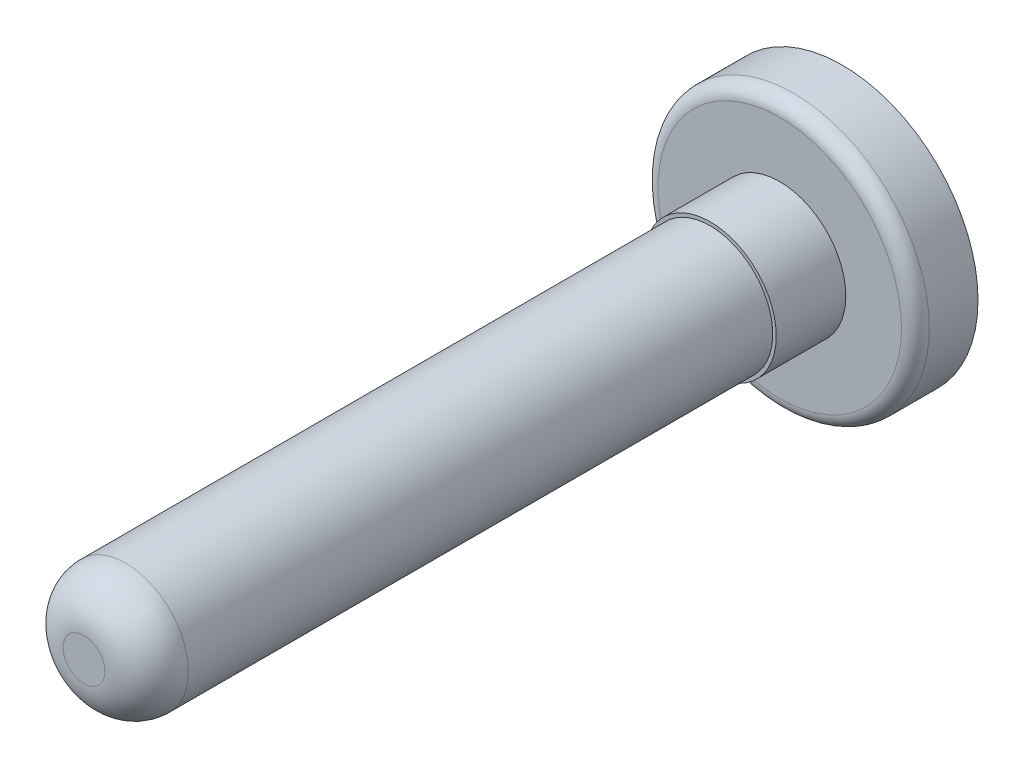
ISO-10303-21;
HEADER;
FILE_DESCRIPTION(('STEP AP214'),'2;1');
FILE_NAME('part.step','',(''),(''),'','','');
FILE_SCHEMA(('AUTOMOTIVE_DESIGN { 1 0 10303 214 1 1 1 1 }'));
ENDSEC;
DATA;
#1=APPLICATION_CONTEXT('core data for automotive mechanical design processes');
#2=APPLICATION_PROTOCOL_DEFINITION('international standard','automotive_design',2000,#1);
#3=PRODUCT_CONTEXT('',#1,'mechanical');
#4=PRODUCT('Part','Part','',(#3));
#5=PRODUCT_RELATED_PRODUCT_CATEGORY('part','',(#4));
#6=PRODUCT_DEFINITION_FORMATION('','',#4);
#7=PRODUCT_DEFINITION_CONTEXT('part definition',#1,'design');
#8=PRODUCT_DEFINITION('design','',#6,#7);
#9=PRODUCT_DEFINITION_SHAPE('','',#8);
#10=(LENGTH_UNIT() NAMED_UNIT(*) SI_UNIT(.MILLI.,.METRE.));
#11=(NAMED_UNIT(*) PLANE_ANGLE_UNIT() SI_UNIT($,.RADIAN.));
#12=(NAMED_UNIT(*) SI_UNIT($,.STERADIAN.) SOLID_ANGLE_UNIT());
#13=UNCERTAINTY_MEASURE_WITH_UNIT(LENGTH_MEASURE(1.E-05),#10,'distance_accuracy_value','');
#14=(GEOMETRIC_REPRESENTATION_CONTEXT(3) GLOBAL_UNCERTAINTY_ASSIGNED_CONTEXT((#13)) GLOBAL_UNIT_ASSIGNED_CONTEXT((#10,
#11,#12)) REPRESENTATION_CONTEXT('',''));
#15=CARTESIAN_POINT('',(0.,0.,0.));
#16=DIRECTION('',(0.,0.,1.));
#17=DIRECTION('',(1.,0.,0.));
#18=AXIS2_PLACEMENT_3D('',#15,#16,#17);
#19=CARTESIAN_POINT('',(0.,0.,4.5));
#20=DIRECTION('',(0.,0.,-1.));
#21=DIRECTION('',(-1.,0.,0.));
#22=AXIS2_PLACEMENT_3D('',#19,#20,#21);
#23=CYLINDRICAL_SURFACE('',#22,9.75);
#24=CARTESIAN_POINT('',(0.,0.,3.5));
#25=DIRECTION('',(0.,0.,1.));
#26=DIRECTION('',(1.,0.,0.));
#27=AXIS2_PLACEMENT_3D('',#24,#25,#26);
#28=CIRCLE('',#27,9.75);
#29=CARTESIAN_POINT('',(9.75,0.,3.5));
#30=VERTEX_POINT('',#29);
#31=EDGE_CURVE('E10',#30,#30,#28,.F.);
#32=ORIENTED_EDGE('',*,*,#31,.T.);
#33=EDGE_LOOP('',(#32));
#34=FACE_BOUND('',#33,.T.);
#35=CARTESIAN_POINT('',(0.,0.,0.));
#36=DIRECTION('',(0.,0.,1.));
#37=DIRECTION('',(1.,0.,0.));
#38=AXIS2_PLACEMENT_3D('',#35,#36,#37);
#39=CIRCLE('',#38,9.75);
#40=CARTESIAN_POINT('',(9.75,0.,0.));
#41=VERTEX_POINT('',#40);
#42=EDGE_CURVE('E62',#41,#41,#39,.T.);
#43=ORIENTED_EDGE('',*,*,#42,.T.);
#44=EDGE_LOOP('',(#43));
#45=FACE_BOUND('',#44,.T.);
#46=ADVANCED_FACE('F37',(#34,#45),#23,.T.);
#47=CARTESIAN_POINT('',(0.,0.,4.5));
#48=DIRECTION('',(0.,0.,1.));
#49=DIRECTION('',(1.,0.,0.));
#50=AXIS2_PLACEMENT_3D('',#47,#48,#49);
#51=PLANE('',#50);
#52=CARTESIAN_POINT('',(0.,0.,4.5));
#53=DIRECTION('',(0.,0.,1.));
#54=DIRECTION('',(1.,0.,0.));
#55=AXIS2_PLACEMENT_3D('',#52,#53,#54);
#56=CIRCLE('',#55,8.75);
#57=CARTESIAN_POINT('',(8.75,0.,4.5));
#58=VERTEX_POINT('',#57);
#59=EDGE_CURVE('E45',#58,#58,#56,.T.);
#60=ORIENTED_EDGE('',*,*,#59,.T.);
#61=EDGE_LOOP('',(#60));
#62=FACE_BOUND('',#61,.T.);
#63=CARTESIAN_POINT('',(0.,0.,4.5));
#64=DIRECTION('',(0.,0.,1.));
#65=DIRECTION('',(1.,0.,0.));
#66=AXIS2_PLACEMENT_3D('',#63,#64,#65);
#67=CIRCLE('',#66,4.75);
#68=CARTESIAN_POINT('',(4.75,0.,4.5));
#69=VERTEX_POINT('',#68);
#70=EDGE_CURVE('E66',#69,#69,#67,.T.);
#71=ORIENTED_EDGE('',*,*,#70,.F.);
#72=EDGE_LOOP('',(#71));
#73=FACE_BOUND('',#72,.T.);
#74=ADVANCED_FACE('F93',(#62,#73),#51,.T.);
#75=CARTESIAN_POINT('',(0.,0.,0.));
#76=DIRECTION('',(0.,0.,1.));
#77=DIRECTION('',(1.,0.,0.));
#78=AXIS2_PLACEMENT_3D('',#75,#76,#77);
#79=PLANE('',#78);
#80=ORIENTED_EDGE('',*,*,#42,.F.);
#81=EDGE_LOOP('',(#80));
#82=FACE_BOUND('',#81,.T.);
#83=ADVANCED_FACE('F89',(#82),#79,.F.);
#84=CARTESIAN_POINT('',(0.,0.,9.5));
#85=DIRECTION('',(0.,0.,-1.));
#86=DIRECTION('',(-1.,0.,0.));
#87=AXIS2_PLACEMENT_3D('',#84,#85,#86);
#88=CYLINDRICAL_SURFACE('',#87,4.75);
#89=CARTESIAN_POINT('',(0.,0.,9.5));
#90=DIRECTION('',(0.,0.,1.));
#91=DIRECTION('',(1.,0.,0.));
#92=AXIS2_PLACEMENT_3D('',#89,#90,#91);
#93=CIRCLE('',#92,4.75);
#94=CARTESIAN_POINT('',(4.75,0.,9.5));
#95=VERTEX_POINT('',#94);
#96=EDGE_CURVE('E67',#95,#95,#93,.T.);
#97=ORIENTED_EDGE('',*,*,#96,.F.);
#98=EDGE_LOOP('',(#97));
#99=FACE_BOUND('',#98,.T.);
#100=ORIENTED_EDGE('',*,*,#70,.T.);
#101=EDGE_LOOP('',(#100));
#102=FACE_BOUND('',#101,.T.);
#103=ADVANCED_FACE('F83',(#99,#102),#88,.T.);
#104=CARTESIAN_POINT('',(0.,0.,9.5));
#105=DIRECTION('',(0.,0.,1.));
#106=DIRECTION('',(1.,0.,0.));
#107=AXIS2_PLACEMENT_3D('',#104,#105,#106);
#108=PLANE('',#107);
#109=CARTESIAN_POINT('',(0.,0.,9.5));
#110=DIRECTION('',(0.,0.,1.));
#111=DIRECTION('',(1.,0.,0.));
#112=AXIS2_PLACEMENT_3D('',#109,#110,#111);
#113=CIRCLE('',#112,4.5);
#114=CARTESIAN_POINT('',(-4.5,0.,9.49999999999999));
#115=VERTEX_POINT('',#114);
#116=EDGE_CURVE('E61',#115,#115,#113,.T.);
#117=ORIENTED_EDGE('',*,*,#116,.F.);
#118=EDGE_LOOP('',(#117));
#119=FACE_BOUND('',#118,.T.);
#120=ORIENTED_EDGE('',*,*,#96,.T.);
#121=EDGE_LOOP('',(#120));
#122=FACE_BOUND('',#121,.T.);
#123=ADVANCED_FACE('F80',(#119,#122),#108,.T.);
#124=CARTESIAN_POINT('',(0.,0.,54.5));
#125=DIRECTION('',(0.,0.,-1.));
#126=DIRECTION('',(-1.,0.,0.));
#127=AXIS2_PLACEMENT_3D('',#124,#125,#126);
#128=CYLINDRICAL_SURFACE('',#127,4.5);
#129=CARTESIAN_POINT('',(0.,0.,51.5));
#130=DIRECTION('',(0.,0.,1.));
#131=DIRECTION('',(1.,0.,0.));
#132=AXIS2_PLACEMENT_3D('',#129,#130,#131);
#133=CIRCLE('',#132,4.5);
#134=CARTESIAN_POINT('',(-4.5,0.,51.5));
#135=VERTEX_POINT('',#134);
#136=EDGE_CURVE('E50',#135,#135,#133,.F.);
#137=CARTESIAN_POINT('',(-4.5,0.,51.5));
#138=CARTESIAN_POINT('',(-4.5,0.,51.0625));
#139=CARTESIAN_POINT('',(-4.5,0.,50.625));
#140=CARTESIAN_POINT('',(-4.5,0.,49.75));
#141=CARTESIAN_POINT('',(-4.5,0.,49.3125));
#142=CARTESIAN_POINT('',(-4.5,0.,48.4375));
#143=CARTESIAN_POINT('',(-4.5,0.,48.));
#144=CARTESIAN_POINT('',(-4.5,0.,47.125));
#145=CARTESIAN_POINT('',(-4.5,0.,46.6875));
#146=CARTESIAN_POINT('',(-4.5,0.,45.8125));
#147=CARTESIAN_POINT('',(-4.5,0.,45.375));
#148=CARTESIAN_POINT('',(-4.5,0.,44.5));
#149=CARTESIAN_POINT('',(-4.5,0.,44.0625));
#150=CARTESIAN_POINT('',(-4.5,0.,43.1875));
#151=CARTESIAN_POINT('',(-4.5,0.,42.75));
#152=CARTESIAN_POINT('',(-4.5,0.,41.875));
#153=CARTESIAN_POINT('',(-4.5,0.,41.4375));
#154=CARTESIAN_POINT('',(-4.5,0.,40.5625));
#155=CARTESIAN_POINT('',(-4.5,0.,40.125));
#156=CARTESIAN_POINT('',(-4.5,0.,39.25));
#157=CARTESIAN_POINT('',(-4.5,0.,38.8125));
#158=CARTESIAN_POINT('',(-4.5,0.,37.9375));
#159=CARTESIAN_POINT('',(-4.5,0.,37.5));
#160=CARTESIAN_POINT('',(-4.5,0.,36.625));
#161=CARTESIAN_POINT('',(-4.5,0.,36.1875));
#162=CARTESIAN_POINT('',(-4.5,0.,35.3125));
#163=CARTESIAN_POINT('',(-4.5,0.,34.875));
#164=CARTESIAN_POINT('',(-4.5,0.,34.));
#165=CARTESIAN_POINT('',(-4.5,0.,33.5625));
#166=CARTESIAN_POINT('',(-4.5,0.,32.6875));
#167=CARTESIAN_POINT('',(-4.5,0.,32.25));
#168=CARTESIAN_POINT('',(-4.5,0.,31.375));
#169=CARTESIAN_POINT('',(-4.5,0.,30.9375));
#170=CARTESIAN_POINT('',(-4.5,0.,30.0625));
#171=CARTESIAN_POINT('',(-4.5,0.,29.625));
#172=CARTESIAN_POINT('',(-4.5,0.,28.75));
#173=CARTESIAN_POINT('',(-4.5,0.,28.3125));
#174=CARTESIAN_POINT('',(-4.5,0.,27.4375));
#175=CARTESIAN_POINT('',(-4.5,0.,27.));
#176=CARTESIAN_POINT('',(-4.5,0.,26.125));
#177=CARTESIAN_POINT('',(-4.5,0.,25.6875));
#178=CARTESIAN_POINT('',(-4.5,0.,24.8125));
#179=CARTESIAN_POINT('',(-4.5,0.,24.375));
#180=CARTESIAN_POINT('',(-4.5,0.,23.5));
#181=CARTESIAN_POINT('',(-4.5,0.,23.0625));
#182=CARTESIAN_POINT('',(-4.5,0.,22.1875));
#183=CARTESIAN_POINT('',(-4.5,0.,21.75));
#184=CARTESIAN_POINT('',(-4.5,0.,20.875));
#185=CARTESIAN_POINT('',(-4.5,0.,20.4375));
#186=CARTESIAN_POINT('',(-4.5,0.,19.5625));
#187=CARTESIAN_POINT('',(-4.5,0.,19.125));
#188=CARTESIAN_POINT('',(-4.5,0.,18.25));
#189=CARTESIAN_POINT('',(-4.5,0.,17.8125));
#190=CARTESIAN_POINT('',(-4.5,0.,16.9375));
#191=CARTESIAN_POINT('',(-4.5,0.,16.5));
#192=CARTESIAN_POINT('',(-4.5,0.,15.625));
#193=CARTESIAN_POINT('',(-4.5,0.,15.1875));
#194=CARTESIAN_POINT('',(-4.5,0.,14.3125));
#195=CARTESIAN_POINT('',(-4.5,0.,13.875));
#196=CARTESIAN_POINT('',(-4.5,0.,13.));
#197=CARTESIAN_POINT('',(-4.5,0.,12.5625));
#198=CARTESIAN_POINT('',(-4.5,0.,11.6875));
#199=CARTESIAN_POINT('',(-4.5,0.,11.25));
#200=CARTESIAN_POINT('',(-4.5,0.,10.375));
#201=CARTESIAN_POINT('',(-4.5,0.,9.93749999999999));
#202=CARTESIAN_POINT('',(-4.5,0.,9.49999999999999));
#203=B_SPLINE_CURVE_WITH_KNOTS('',3,(#137,#138,#139,#140,#141,#142,#143,#144,#145,#146,#147,
#148,#149,#150,#151,#152,#153,#154,#155,#156,#157,#158,#159,#160,#161,#162,#163,#164,#165,#166,
#167,#168,#169,#170,#171,#172,#173,#174,#175,#176,#177,#178,#179,#180,#181,#182,#183,#184,#185,
#186,#187,#188,#189,#190,#191,#192,#193,#194,#195,#196,#197,#198,#199,#200,#201,#202),
.UNSPECIFIED.,.F.,.F.,(4,2,2,2,2,2,2,2,2,2,2,2,2,2,2,2,2,2,2,2,2,2,2,2,2,2,2,2,2,2,2,2,4),(0.,
1.3125,2.625,3.9375,5.25,6.56250000000001,7.875,9.1875,10.5,11.8125,13.125,14.4375,15.75,
17.0625,18.375,19.6875,21.,22.3125,23.625,24.9375,26.25,27.5625,28.875,30.1875,31.5,32.8125,
34.125,35.4375,36.75,38.0625,39.375,40.6875,42.),.UNSPECIFIED.);
#204=EDGE_CURVE('BSEAM78',#135,#115,#203,.T.);
#205=ORIENTED_EDGE('',*,*,#136,.T.);
#206=ORIENTED_EDGE('',*,*,#116,.T.);
#207=ORIENTED_EDGE('',*,*,#204,.T.);
#208=ORIENTED_EDGE('',*,*,#204,.F.);
#209=EDGE_LOOP('',(#205,#207,#206,#208));
#210=FACE_BOUND('',#209,.T.);
#211=ADVANCED_FACE('F78',(#210),#128,.T.);
#212=CARTESIAN_POINT('',(0.,0.,54.5));
#213=DIRECTION('',(0.,0.,1.));
#214=DIRECTION('',(1.,0.,0.));
#215=AXIS2_PLACEMENT_3D('',#212,#213,#214);
#216=PLANE('',#215);
#217=CARTESIAN_POINT('',(0.,0.,54.5));
#218=DIRECTION('',(0.,0.,1.));
#219=DIRECTION('',(1.,0.,0.));
#220=AXIS2_PLACEMENT_3D('',#217,#218,#219);
#221=CIRCLE('',#220,1.5);
#222=CARTESIAN_POINT('',(1.5,0.,54.5));
#223=VERTEX_POINT('',#222);
#224=EDGE_CURVE('E55',#223,#223,#221,.T.);
#225=ORIENTED_EDGE('',*,*,#224,.T.);
#226=EDGE_LOOP('',(#225));
#227=FACE_BOUND('',#226,.T.);
#228=ADVANCED_FACE('F105',(#227),#216,.T.);
#229=CARTESIAN_POINT('',(0.,0.,51.5));
#230=DIRECTION('',(0.,0.,1.));
#231=DIRECTION('',(1.,0.,0.));
#232=AXIS2_PLACEMENT_3D('',#229,#230,#231);
#233=DEGENERATE_TOROIDAL_SURFACE('',#232,1.5,3.,.T.);
#234=ORIENTED_EDGE('',*,*,#136,.F.);
#235=EDGE_LOOP('',(#234));
#236=FACE_BOUND('',#235,.T.);
#237=ORIENTED_EDGE('',*,*,#224,.F.);
#238=EDGE_LOOP('',(#237));
#239=FACE_BOUND('',#238,.T.);
#240=ADVANCED_FACE('F103',(#236,#239),#233,.T.);
#241=CARTESIAN_POINT('',(0.,0.,3.5));
#242=DIRECTION('',(0.,0.,1.));
#243=DIRECTION('',(1.,0.,0.));
#244=AXIS2_PLACEMENT_3D('',#241,#242,#243);
#245=TOROIDAL_SURFACE('',#244,8.75,1.);
#246=ORIENTED_EDGE('',*,*,#31,.F.);
#247=EDGE_LOOP('',(#246));
#248=FACE_BOUND('',#247,.T.);
#249=ORIENTED_EDGE('',*,*,#59,.F.);
#250=EDGE_LOOP('',(#249));
#251=FACE_BOUND('',#250,.T.);
#252=ADVANCED_FACE('F39',(#248,#251),#245,.T.);
#253=CLOSED_SHELL('',(#46,#74,#83,#103,#123,#211,#228,#240,#252));
#254=MANIFOLD_SOLID_BREP('B2',#253);
#255=ADVANCED_BREP_SHAPE_REPRESENTATION('',(#18,#254),#14);
#256=SHAPE_DEFINITION_REPRESENTATION(#9,#255);
ENDSEC;
END-ISO-10303-21;
